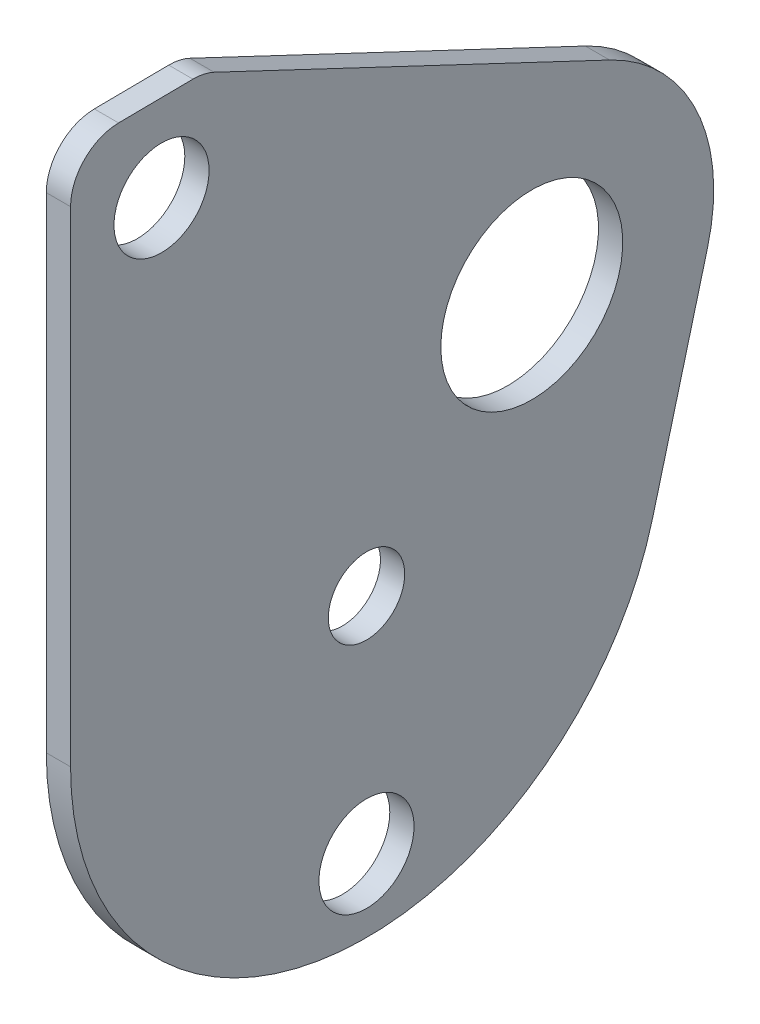
ISO-10303-21;
HEADER;
FILE_DESCRIPTION(('STEP AP214'),'2;1');
FILE_NAME('part.step','',(''),(''),'','','');
FILE_SCHEMA(('AUTOMOTIVE_DESIGN { 1 0 10303 214 1 1 1 1 }'));
ENDSEC;
DATA;
#1=APPLICATION_CONTEXT('core data for automotive mechanical design processes');
#2=APPLICATION_PROTOCOL_DEFINITION('international standard','automotive_design',2000,#1);
#3=PRODUCT_CONTEXT('',#1,'mechanical');
#4=PRODUCT('Part','Part','',(#3));
#5=PRODUCT_RELATED_PRODUCT_CATEGORY('part','',(#4));
#6=PRODUCT_DEFINITION_FORMATION('','',#4);
#7=PRODUCT_DEFINITION_CONTEXT('part definition',#1,'design');
#8=PRODUCT_DEFINITION('design','',#6,#7);
#9=PRODUCT_DEFINITION_SHAPE('','',#8);
#10=(LENGTH_UNIT() NAMED_UNIT(*) SI_UNIT(.MILLI.,.METRE.));
#11=(NAMED_UNIT(*) PLANE_ANGLE_UNIT() SI_UNIT($,.RADIAN.));
#12=(NAMED_UNIT(*) SI_UNIT($,.STERADIAN.) SOLID_ANGLE_UNIT());
#13=UNCERTAINTY_MEASURE_WITH_UNIT(LENGTH_MEASURE(1.E-05),#10,'distance_accuracy_value','');
#14=(GEOMETRIC_REPRESENTATION_CONTEXT(3) GLOBAL_UNCERTAINTY_ASSIGNED_CONTEXT((#13)) GLOBAL_UNIT_ASSIGNED_CONTEXT((#10,
#11,#12)) REPRESENTATION_CONTEXT('',''));
#15=CARTESIAN_POINT('',(0.,0.,0.));
#16=DIRECTION('',(0.,0.,1.));
#17=DIRECTION('',(1.,0.,0.));
#18=AXIS2_PLACEMENT_3D('',#15,#16,#17);
#19=CARTESIAN_POINT('',(18.2118,32.6740607769863,-155.239693244064));
#20=DIRECTION('',(0.,-0.999949674871077,-0.0100323339870091));
#21=DIRECTION('',(0.,0.0100323339870091,-0.999949674871077));
#22=AXIS2_PLACEMENT_3D('',#19,#20,#21);
#23=PLANE('',#22);
#24=DIRECTION('',(0.,-0.0100323339870091,0.999949674871077));
#25=VECTOR('',#24,1.);
#26=CARTESIAN_POINT('',(18.2118,32.6740607769863,-155.239693244064));
#27=LINE('',#26,#25);
#28=CARTESIAN_POINT('',(18.2118,32.7383484801759,-161.64742129478));
#29=VERTEX_POINT('',#28);
#30=CARTESIAN_POINT('',(18.2118,32.6992885296811,-157.754211115736));
#31=VERTEX_POINT('',#30);
#32=EDGE_CURVE('E168',#29,#31,#27,.T.);
#33=ORIENTED_EDGE('',*,*,#32,.T.);
#34=DIRECTION('',(-1.,0.,0.));
#35=VECTOR('',#34,1.);
#36=CARTESIAN_POINT('',(18.2118,32.6992885296811,-157.754211115736));
#37=LINE('',#36,#35);
#38=CARTESIAN_POINT('',(19.4818,32.6992885296811,-157.754211115736));
#39=VERTEX_POINT('',#38);
#40=EDGE_CURVE('E59',#31,#39,#37,.F.);
#41=ORIENTED_EDGE('',*,*,#40,.T.);
#42=DIRECTION('',(0.,-0.0100323339870091,0.999949674871077));
#43=VECTOR('',#42,1.);
#44=CARTESIAN_POINT('',(19.4818,32.6740607769863,-155.239693244064));
#45=LINE('',#44,#43);
#46=CARTESIAN_POINT('',(19.4818,32.7383484801759,-161.64742129478));
#47=VERTEX_POINT('',#46);
#48=EDGE_CURVE('E152',#47,#39,#45,.T.);
#49=ORIENTED_EDGE('',*,*,#48,.F.);
#50=DIRECTION('',(1.,0.,0.));
#51=VECTOR('',#50,1.);
#52=CARTESIAN_POINT('',(18.2118,32.7383484801759,-161.64742129478));
#53=LINE('',#52,#51);
#54=EDGE_CURVE('E145',#47,#29,#53,.F.);
#55=ORIENTED_EDGE('',*,*,#54,.T.);
#56=EDGE_LOOP('',(#33,#41,#49,#55));
#57=FACE_BOUND('',#56,.T.);
#58=ADVANCED_FACE('F37',(#57),#23,.F.);
#59=CARTESIAN_POINT('',(18.2118,4.7625,-170.733693244064));
#60=DIRECTION('',(-1.,0.,0.));
#61=DIRECTION('',(0.,0.,1.));
#62=AXIS2_PLACEMENT_3D('',#59,#60,#61);
#63=CYLINDRICAL_SURFACE('',#62,15.494);
#64=CARTESIAN_POINT('',(19.4818,4.7625,-170.733693244064));
#65=DIRECTION('',(1.,0.,0.));
#66=DIRECTION('',(0.,0.,-1.));
#67=AXIS2_PLACEMENT_3D('',#64,#65,#66);
#68=CIRCLE('',#67,15.494);
#69=CARTESIAN_POINT('',(19.4818,4.76249999999999,-155.239693244064));
#70=VERTEX_POINT('',#69);
#71=CARTESIAN_POINT('',(19.4818,0.784017616500314,-185.70819537015));
#72=VERTEX_POINT('',#71);
#73=EDGE_CURVE('E182',#70,#72,#68,.T.);
#74=ORIENTED_EDGE('',*,*,#73,.F.);
#75=DIRECTION('',(-1.,0.,0.));
#76=VECTOR('',#75,1.);
#77=CARTESIAN_POINT('',(22.9743,4.76249999999999,-155.239693244064));
#78=LINE('',#77,#76);
#79=CARTESIAN_POINT('',(18.2118,4.76249999999999,-155.239693244064));
#80=VERTEX_POINT('',#79);
#81=EDGE_CURVE('E160',#70,#80,#78,.T.);
#82=ORIENTED_EDGE('',*,*,#81,.T.);
#83=CARTESIAN_POINT('',(18.2118,4.7625,-170.733693244064));
#84=DIRECTION('',(1.,0.,0.));
#85=DIRECTION('',(0.,0.,-1.));
#86=AXIS2_PLACEMENT_3D('',#83,#84,#85);
#87=CIRCLE('',#86,15.494);
#88=CARTESIAN_POINT('',(18.2118,0.784017616500314,-185.70819537015));
#89=VERTEX_POINT('',#88);
#90=EDGE_CURVE('E137',#80,#89,#87,.T.);
#91=ORIENTED_EDGE('',*,*,#90,.T.);
#92=DIRECTION('',(1.,0.,0.));
#93=VECTOR('',#92,1.);
#94=CARTESIAN_POINT('',(-33.8582,0.784017616500314,-185.70819537015));
#95=LINE('',#94,#93);
#96=EDGE_CURVE('E135',#89,#72,#95,.T.);
#97=ORIENTED_EDGE('',*,*,#96,.T.);
#98=EDGE_LOOP('',(#74,#82,#91,#97));
#99=FACE_BOUND('',#98,.T.);
#100=ADVANCED_FACE('F204',(#99),#63,.T.);
#101=CARTESIAN_POINT('',(18.2118,23.6225731721549,-155.239693244064));
#102=DIRECTION('',(0.,0.,-1.));
#103=DIRECTION('',(-1.,0.,0.));
#104=AXIS2_PLACEMENT_3D('',#101,#102,#103);
#105=PLANE('',#104);
#106=DIRECTION('',(0.,-1.,0.));
#107=VECTOR('',#106,1.);
#108=CARTESIAN_POINT('',(19.4818,23.6225731721549,-155.239693244064));
#109=LINE('',#108,#107);
#110=CARTESIAN_POINT('',(19.4818,30.1594163555086,-155.239693244064));
#111=VERTEX_POINT('',#110);
#112=EDGE_CURVE('E150',#111,#70,#109,.T.);
#113=ORIENTED_EDGE('',*,*,#112,.F.);
#114=DIRECTION('',(-1.,0.,0.));
#115=VECTOR('',#114,1.);
#116=CARTESIAN_POINT('',(18.2118,30.1594163555086,-155.239693244064));
#117=LINE('',#116,#115);
#118=CARTESIAN_POINT('',(18.2118,30.1594163555086,-155.239693244064));
#119=VERTEX_POINT('',#118);
#120=EDGE_CURVE('E115',#111,#119,#117,.T.);
#121=ORIENTED_EDGE('',*,*,#120,.T.);
#122=DIRECTION('',(0.,-1.,0.));
#123=VECTOR('',#122,1.);
#124=CARTESIAN_POINT('',(18.2118,32.6740607769863,-155.239693244064));
#125=LINE('',#124,#123);
#126=EDGE_CURVE('E171',#119,#80,#125,.T.);
#127=ORIENTED_EDGE('',*,*,#126,.T.);
#128=ORIENTED_EDGE('',*,*,#81,.F.);
#129=EDGE_LOOP('',(#113,#121,#127,#128));
#130=FACE_BOUND('',#129,.T.);
#131=ADVANCED_FACE('F157',(#130),#105,.F.);
#132=CARTESIAN_POINT('',(22.9743,4.7625,-170.733693244064));
#133=DIRECTION('',(-1.,0.,0.));
#134=DIRECTION('',(0.,0.,1.));
#135=AXIS2_PLACEMENT_3D('',#132,#133,#134);
#136=CYLINDRICAL_SURFACE('',#135,2.);
#137=CARTESIAN_POINT('',(18.2118,4.7625,-170.733693244064));
#138=DIRECTION('',(1.,0.,0.));
#139=DIRECTION('',(0.,0.,-1.));
#140=AXIS2_PLACEMENT_3D('',#137,#138,#139);
#141=CIRCLE('',#140,2.);
#142=CARTESIAN_POINT('',(18.2118,4.7625,-168.733693244064));
#143=VERTEX_POINT('',#142);
#144=EDGE_CURVE('E172',#143,#143,#141,.T.);
#145=CARTESIAN_POINT('',(19.4818,4.7625,-170.733693244064));
#146=DIRECTION('',(1.,0.,0.));
#147=DIRECTION('',(0.,0.,-1.));
#148=AXIS2_PLACEMENT_3D('',#145,#146,#147);
#149=CIRCLE('',#148,2.);
#150=CARTESIAN_POINT('',(19.4818,4.7625,-168.733693244064));
#151=VERTEX_POINT('',#150);
#152=EDGE_CURVE('E173',#151,#151,#149,.T.);
#153=CARTESIAN_POINT('',(18.2118,4.7625,-168.733693244064));
#154=CARTESIAN_POINT('',(18.2250291666667,4.7625,-168.733693244064));
#155=CARTESIAN_POINT('',(18.2382583333334,4.7625,-168.733693244064));
#156=CARTESIAN_POINT('',(18.2647166666667,4.7625,-168.733693244064));
#157=CARTESIAN_POINT('',(18.2779458333334,4.7625,-168.733693244064));
#158=CARTESIAN_POINT('',(18.3044041666667,4.7625,-168.733693244064));
#159=CARTESIAN_POINT('',(18.3176333333334,4.7625,-168.733693244064));
#160=CARTESIAN_POINT('',(18.3440916666667,4.7625,-168.733693244064));
#161=CARTESIAN_POINT('',(18.3573208333334,4.7625,-168.733693244064));
#162=CARTESIAN_POINT('',(18.3837791666667,4.7625,-168.733693244064));
#163=CARTESIAN_POINT('',(18.3970083333333,4.7625,-168.733693244064));
#164=CARTESIAN_POINT('',(18.4234666666667,4.7625,-168.733693244064));
#165=CARTESIAN_POINT('',(18.4366958333333,4.7625,-168.733693244064));
#166=CARTESIAN_POINT('',(18.4631541666667,4.7625,-168.733693244064));
#167=CARTESIAN_POINT('',(18.4763833333333,4.7625,-168.733693244064));
#168=CARTESIAN_POINT('',(18.5028416666667,4.7625,-168.733693244064));
#169=CARTESIAN_POINT('',(18.5160708333333,4.7625,-168.733693244064));
#170=CARTESIAN_POINT('',(18.5425291666667,4.7625,-168.733693244064));
#171=CARTESIAN_POINT('',(18.5557583333333,4.7625,-168.733693244064));
#172=CARTESIAN_POINT('',(18.5822166666667,4.7625,-168.733693244064));
#173=CARTESIAN_POINT('',(18.5954458333334,4.7625,-168.733693244064));
#174=CARTESIAN_POINT('',(18.6219041666667,4.7625,-168.733693244064));
#175=CARTESIAN_POINT('',(18.6351333333333,4.7625,-168.733693244064));
#176=CARTESIAN_POINT('',(18.6615916666667,4.7625,-168.733693244064));
#177=CARTESIAN_POINT('',(18.6748208333334,4.7625,-168.733693244064));
#178=CARTESIAN_POINT('',(18.7012791666667,4.7625,-168.733693244064));
#179=CARTESIAN_POINT('',(18.7145083333333,4.7625,-168.733693244064));
#180=CARTESIAN_POINT('',(18.7409666666667,4.7625,-168.733693244064));
#181=CARTESIAN_POINT('',(18.7541958333334,4.7625,-168.733693244064));
#182=CARTESIAN_POINT('',(18.7806541666667,4.7625,-168.733693244064));
#183=CARTESIAN_POINT('',(18.7938833333334,4.7625,-168.733693244064));
#184=CARTESIAN_POINT('',(18.8203416666667,4.7625,-168.733693244064));
#185=CARTESIAN_POINT('',(18.8335708333334,4.7625,-168.733693244064));
#186=CARTESIAN_POINT('',(18.8600291666667,4.7625,-168.733693244064));
#187=CARTESIAN_POINT('',(18.8732583333334,4.7625,-168.733693244064));
#188=CARTESIAN_POINT('',(18.8997166666667,4.7625,-168.733693244064));
#189=CARTESIAN_POINT('',(18.9129458333333,4.7625,-168.733693244064));
#190=CARTESIAN_POINT('',(18.9394041666667,4.7625,-168.733693244064));
#191=CARTESIAN_POINT('',(18.9526333333333,4.7625,-168.733693244064));
#192=CARTESIAN_POINT('',(18.9790916666667,4.7625,-168.733693244064));
#193=CARTESIAN_POINT('',(18.9923208333334,4.7625,-168.733693244064));
#194=CARTESIAN_POINT('',(19.0187791666667,4.7625,-168.733693244064));
#195=CARTESIAN_POINT('',(19.0320083333334,4.7625,-168.733693244064));
#196=CARTESIAN_POINT('',(19.0584666666667,4.7625,-168.733693244064));
#197=CARTESIAN_POINT('',(19.0716958333334,4.7625,-168.733693244064));
#198=CARTESIAN_POINT('',(19.0981541666667,4.7625,-168.733693244064));
#199=CARTESIAN_POINT('',(19.1113833333334,4.7625,-168.733693244064));
#200=CARTESIAN_POINT('',(19.1378416666667,4.7625,-168.733693244064));
#201=CARTESIAN_POINT('',(19.1510708333333,4.7625,-168.733693244064));
#202=CARTESIAN_POINT('',(19.1775291666667,4.7625,-168.733693244064));
#203=CARTESIAN_POINT('',(19.1907583333333,4.7625,-168.733693244064));
#204=CARTESIAN_POINT('',(19.2172166666667,4.7625,-168.733693244064));
#205=CARTESIAN_POINT('',(19.2304458333333,4.7625,-168.733693244064));
#206=CARTESIAN_POINT('',(19.2569041666667,4.7625,-168.733693244064));
#207=CARTESIAN_POINT('',(19.2701333333333,4.7625,-168.733693244064));
#208=CARTESIAN_POINT('',(19.2965916666667,4.7625,-168.733693244064));
#209=CARTESIAN_POINT('',(19.3098208333333,4.7625,-168.733693244064));
#210=CARTESIAN_POINT('',(19.3362791666667,4.7625,-168.733693244064));
#211=CARTESIAN_POINT('',(19.3495083333333,4.7625,-168.733693244064));
#212=CARTESIAN_POINT('',(19.3759666666667,4.7625,-168.733693244064));
#213=CARTESIAN_POINT('',(19.3891958333333,4.7625,-168.733693244064));
#214=CARTESIAN_POINT('',(19.4156541666667,4.7625,-168.733693244064));
#215=CARTESIAN_POINT('',(19.4288833333334,4.7625,-168.733693244064));
#216=CARTESIAN_POINT('',(19.4553416666667,4.7625,-168.733693244064));
#217=CARTESIAN_POINT('',(19.4685708333334,4.7625,-168.733693244064));
#218=CARTESIAN_POINT('',(19.4818,4.7625,-168.733693244064));
#219=B_SPLINE_CURVE_WITH_KNOTS('',3,(#153,#154,#155,#156,#157,#158,#159,#160,#161,#162,#163,
#164,#165,#166,#167,#168,#169,#170,#171,#172,#173,#174,#175,#176,#177,#178,#179,#180,#181,#182,
#183,#184,#185,#186,#187,#188,#189,#190,#191,#192,#193,#194,#195,#196,#197,#198,#199,#200,#201,
#202,#203,#204,#205,#206,#207,#208,#209,#210,#211,#212,#213,#214,#215,#216,#217,#218),
.UNSPECIFIED.,.F.,.F.,(4,2,2,2,2,2,2,2,2,2,2,2,2,2,2,2,2,2,2,2,2,2,2,2,2,2,2,2,2,2,2,2,4),(0.,
0.0396874999999998,0.0793749999999996,0.119062499999999,0.158749999999999,0.198437499999999,
0.238124999999999,0.277812499999999,0.317499999999998,0.357187499999998,0.396874999999998,
0.436562499999998,0.476250000000001,0.515937499999997,0.555625000000001,0.5953125,0.635,
0.6746875,0.714375,0.7540625,0.793749999999999,0.833437499999999,0.873124999999999,
0.912812499999999,0.952499999999998,0.992187499999998,1.031875,1.0715625,1.11125,1.1509375,
1.190625,1.2303125,1.27),.UNSPECIFIED.);
#220=EDGE_CURVE('BSEAM224',#143,#151,#219,.T.);
#221=ORIENTED_EDGE('',*,*,#144,.F.);
#222=ORIENTED_EDGE('',*,*,#152,.T.);
#223=ORIENTED_EDGE('',*,*,#220,.T.);
#224=ORIENTED_EDGE('',*,*,#220,.F.);
#225=EDGE_LOOP('',(#221,#223,#222,#224));
#226=FACE_BOUND('',#225,.T.);
#227=ADVANCED_FACE('F224',(#226),#136,.F.);
#228=CARTESIAN_POINT('',(40.0253837676858,14.088357975241,-179.3875));
#229=DIRECTION('',(-1.,0.,0.));
#230=DIRECTION('',(0.,0.,1.));
#231=AXIS2_PLACEMENT_3D('',#228,#229,#230);
#232=CYLINDRICAL_SURFACE('',#231,4.76250000000001);
#233=CARTESIAN_POINT('',(18.2118,14.088357975241,-179.3875));
#234=DIRECTION('',(-1.,0.,0.));
#235=DIRECTION('',(0.,0.,1.));
#236=AXIS2_PLACEMENT_3D('',#233,#234,#235);
#237=CIRCLE('',#236,4.76250000000001);
#238=CARTESIAN_POINT('',(18.2118,14.088357975241,-174.625));
#239=VERTEX_POINT('',#238);
#240=EDGE_CURVE('E161',#239,#239,#237,.T.);
#241=CARTESIAN_POINT('',(19.4818,14.088357975241,-179.3875));
#242=DIRECTION('',(1.,0.,0.));
#243=DIRECTION('',(0.,0.,-1.));
#244=AXIS2_PLACEMENT_3D('',#241,#242,#243);
#245=CIRCLE('',#244,4.76250000000001);
#246=CARTESIAN_POINT('',(19.4818,14.088357975241,-174.625));
#247=VERTEX_POINT('',#246);
#248=EDGE_CURVE('E122',#247,#247,#245,.F.);
#249=CARTESIAN_POINT('',(18.2118,14.088357975241,-174.625));
#250=CARTESIAN_POINT('',(18.2250291666667,14.088357975241,-174.625));
#251=CARTESIAN_POINT('',(18.2382583333334,14.088357975241,-174.625));
#252=CARTESIAN_POINT('',(18.2647166666667,14.088357975241,-174.625));
#253=CARTESIAN_POINT('',(18.2779458333334,14.088357975241,-174.625));
#254=CARTESIAN_POINT('',(18.3044041666667,14.088357975241,-174.625));
#255=CARTESIAN_POINT('',(18.3176333333334,14.088357975241,-174.625));
#256=CARTESIAN_POINT('',(18.3440916666667,14.088357975241,-174.625));
#257=CARTESIAN_POINT('',(18.3573208333334,14.088357975241,-174.625));
#258=CARTESIAN_POINT('',(18.3837791666667,14.088357975241,-174.625));
#259=CARTESIAN_POINT('',(18.3970083333333,14.088357975241,-174.625));
#260=CARTESIAN_POINT('',(18.4234666666667,14.088357975241,-174.625));
#261=CARTESIAN_POINT('',(18.4366958333333,14.088357975241,-174.625));
#262=CARTESIAN_POINT('',(18.4631541666667,14.088357975241,-174.625));
#263=CARTESIAN_POINT('',(18.4763833333333,14.088357975241,-174.625));
#264=CARTESIAN_POINT('',(18.5028416666667,14.088357975241,-174.625));
#265=CARTESIAN_POINT('',(18.5160708333333,14.088357975241,-174.625));
#266=CARTESIAN_POINT('',(18.5425291666667,14.088357975241,-174.625));
#267=CARTESIAN_POINT('',(18.5557583333334,14.088357975241,-174.625));
#268=CARTESIAN_POINT('',(18.5822166666667,14.088357975241,-174.625));
#269=CARTESIAN_POINT('',(18.5954458333334,14.088357975241,-174.625));
#270=CARTESIAN_POINT('',(18.6219041666667,14.088357975241,-174.625));
#271=CARTESIAN_POINT('',(18.6351333333334,14.088357975241,-174.625));
#272=CARTESIAN_POINT('',(18.6615916666667,14.088357975241,-174.625));
#273=CARTESIAN_POINT('',(18.6748208333334,14.088357975241,-174.625));
#274=CARTESIAN_POINT('',(18.7012791666667,14.088357975241,-174.625));
#275=CARTESIAN_POINT('',(18.7145083333334,14.088357975241,-174.625));
#276=CARTESIAN_POINT('',(18.7409666666667,14.088357975241,-174.625));
#277=CARTESIAN_POINT('',(18.7541958333334,14.088357975241,-174.625));
#278=CARTESIAN_POINT('',(18.7806541666667,14.088357975241,-174.625));
#279=CARTESIAN_POINT('',(18.7938833333334,14.088357975241,-174.625));
#280=CARTESIAN_POINT('',(18.8203416666667,14.088357975241,-174.625));
#281=CARTESIAN_POINT('',(18.8335708333334,14.088357975241,-174.625));
#282=CARTESIAN_POINT('',(18.8600291666667,14.088357975241,-174.625));
#283=CARTESIAN_POINT('',(18.8732583333334,14.088357975241,-174.625));
#284=CARTESIAN_POINT('',(18.8997166666667,14.088357975241,-174.625));
#285=CARTESIAN_POINT('',(18.9129458333333,14.088357975241,-174.625));
#286=CARTESIAN_POINT('',(18.9394041666667,14.088357975241,-174.625));
#287=CARTESIAN_POINT('',(18.9526333333333,14.088357975241,-174.625));
#288=CARTESIAN_POINT('',(18.9790916666667,14.088357975241,-174.625));
#289=CARTESIAN_POINT('',(18.9923208333334,14.088357975241,-174.625));
#290=CARTESIAN_POINT('',(19.0187791666667,14.088357975241,-174.625));
#291=CARTESIAN_POINT('',(19.0320083333334,14.088357975241,-174.625));
#292=CARTESIAN_POINT('',(19.0584666666667,14.088357975241,-174.625));
#293=CARTESIAN_POINT('',(19.0716958333334,14.088357975241,-174.625));
#294=CARTESIAN_POINT('',(19.0981541666667,14.088357975241,-174.625));
#295=CARTESIAN_POINT('',(19.1113833333334,14.088357975241,-174.625));
#296=CARTESIAN_POINT('',(19.1378416666667,14.088357975241,-174.625));
#297=CARTESIAN_POINT('',(19.1510708333334,14.088357975241,-174.625));
#298=CARTESIAN_POINT('',(19.1775291666667,14.088357975241,-174.625));
#299=CARTESIAN_POINT('',(19.1907583333334,14.088357975241,-174.625));
#300=CARTESIAN_POINT('',(19.2172166666667,14.088357975241,-174.625));
#301=CARTESIAN_POINT('',(19.2304458333334,14.088357975241,-174.625));
#302=CARTESIAN_POINT('',(19.2569041666667,14.088357975241,-174.625));
#303=CARTESIAN_POINT('',(19.2701333333334,14.088357975241,-174.625));
#304=CARTESIAN_POINT('',(19.2965916666667,14.088357975241,-174.625));
#305=CARTESIAN_POINT('',(19.3098208333334,14.088357975241,-174.625));
#306=CARTESIAN_POINT('',(19.3362791666667,14.088357975241,-174.625));
#307=CARTESIAN_POINT('',(19.3495083333334,14.088357975241,-174.625));
#308=CARTESIAN_POINT('',(19.3759666666667,14.088357975241,-174.625));
#309=CARTESIAN_POINT('',(19.3891958333334,14.088357975241,-174.625));
#310=CARTESIAN_POINT('',(19.4156541666667,14.088357975241,-174.625));
#311=CARTESIAN_POINT('',(19.4288833333334,14.088357975241,-174.625));
#312=CARTESIAN_POINT('',(19.4553416666667,14.088357975241,-174.625));
#313=CARTESIAN_POINT('',(19.4685708333334,14.088357975241,-174.625));
#314=CARTESIAN_POINT('',(19.4818,14.088357975241,-174.625));
#315=B_SPLINE_CURVE_WITH_KNOTS('',3,(#249,#250,#251,#252,#253,#254,#255,#256,#257,#258,#259,
#260,#261,#262,#263,#264,#265,#266,#267,#268,#269,#270,#271,#272,#273,#274,#275,#276,#277,#278,
#279,#280,#281,#282,#283,#284,#285,#286,#287,#288,#289,#290,#291,#292,#293,#294,#295,#296,#297,
#298,#299,#300,#301,#302,#303,#304,#305,#306,#307,#308,#309,#310,#311,#312,#313,#314),
.UNSPECIFIED.,.F.,.F.,(4,2,2,2,2,2,2,2,2,2,2,2,2,2,2,2,2,2,2,2,2,2,2,2,2,2,2,2,2,2,2,2,4),(0.,
0.0396874999999998,0.0793749999999996,0.119062499999999,0.158749999999999,0.198437499999999,
0.238124999999999,0.277812499999999,0.317499999999998,0.357187500000002,0.396875000000001,
0.436562500000001,0.476250000000001,0.515937500000001,0.555625000000001,0.5953125,0.635,
0.6746875,0.714375,0.7540625,0.793749999999999,0.833437499999999,0.873124999999999,
0.912812499999999,0.952500000000002,0.992187500000002,1.031875,1.0715625,1.11125,1.1509375,
1.190625,1.2303125,1.27),.UNSPECIFIED.);
#316=EDGE_CURVE('BSEAM221',#239,#247,#315,.T.);
#317=ORIENTED_EDGE('',*,*,#240,.T.);
#318=ORIENTED_EDGE('',*,*,#248,.F.);
#319=ORIENTED_EDGE('',*,*,#316,.T.);
#320=ORIENTED_EDGE('',*,*,#316,.F.);
#321=EDGE_LOOP('',(#317,#319,#318,#320));
#322=FACE_BOUND('',#321,.T.);
#323=ADVANCED_FACE('F221',(#322),#232,.F.);
#324=CARTESIAN_POINT('',(-33.8582,89.4766831336706,-42.3403974478338));
#325=DIRECTION('',(0.,-0.903906976361632,0.427729094269693));
#326=DIRECTION('',(0.,-0.427729094269693,-0.903906976361632));
#327=AXIS2_PLACEMENT_3D('',#324,#325,#326);
#328=PLANE('',#327);
#329=DIRECTION('',(0.,-0.427729094269693,-0.903906976361632));
#330=VECTOR('',#329,1.);
#331=CARTESIAN_POINT('',(18.2118,3.82570673011289,-223.344018993732));
#332=LINE('',#331,#330);
#333=CARTESIAN_POINT('',(18.2118,32.4944000259619,-162.759335322552));
#334=VERTEX_POINT('',#333);
#335=CARTESIAN_POINT('',(18.2118,22.6980719250855,-183.461619622919));
#336=VERTEX_POINT('',#335);
#337=EDGE_CURVE('E176',#334,#336,#332,.T.);
#338=ORIENTED_EDGE('',*,*,#337,.F.);
#339=DIRECTION('',(1.,0.,0.));
#340=VECTOR('',#339,1.);
#341=CARTESIAN_POINT('',(-33.8582,32.4944000259619,-162.759335322552));
#342=LINE('',#341,#340);
#343=CARTESIAN_POINT('',(19.4818,32.4944000259619,-162.759335322552));
#344=VERTEX_POINT('',#343);
#345=EDGE_CURVE('E11',#334,#344,#342,.T.);
#346=ORIENTED_EDGE('',*,*,#345,.T.);
#347=DIRECTION('',(0.,0.427729094269693,0.903906976361632));
#348=VECTOR('',#347,1.);
#349=CARTESIAN_POINT('',(19.4818,89.4766831336706,-42.3403974478338));
#350=LINE('',#349,#348);
#351=CARTESIAN_POINT('',(19.4818,22.6980719250855,-183.461619622919));
#352=VERTEX_POINT('',#351);
#353=EDGE_CURVE('E108',#352,#344,#350,.T.);
#354=ORIENTED_EDGE('',*,*,#353,.F.);
#355=DIRECTION('',(1.,0.,0.));
#356=VECTOR('',#355,1.);
#357=CARTESIAN_POINT('',(-33.8582,22.6980719250855,-183.461619622919));
#358=LINE('',#357,#356);
#359=EDGE_CURVE('E116',#336,#352,#358,.T.);
#360=ORIENTED_EDGE('',*,*,#359,.F.);
#361=EDGE_LOOP('',(#338,#346,#354,#360));
#362=FACE_BOUND('',#361,.T.);
#363=ADVANCED_FACE('F121',(#362),#328,.F.);
#364=CARTESIAN_POINT('',(-33.8582,-46.0348142516997,-173.26919097219));
#365=DIRECTION('',(0.,-0.256775679843789,-0.966471029178195));
#366=DIRECTION('',(0.,0.966471029178195,-0.256775679843789));
#367=AXIS2_PLACEMENT_3D('',#364,#365,#366);
#368=PLANE('',#367);
#369=DIRECTION('',(1.,0.,0.));
#370=VECTOR('',#369,1.);
#371=CARTESIAN_POINT('',(-33.8582,11.6425696247289,-188.593136552922));
#372=LINE('',#371,#370);
#373=CARTESIAN_POINT('',(18.2118,11.6425696247289,-188.593136552922));
#374=VERTEX_POINT('',#373);
#375=CARTESIAN_POINT('',(19.4818,11.6425696247289,-188.593136552922));
#376=VERTEX_POINT('',#375);
#377=EDGE_CURVE('E128',#374,#376,#372,.T.);
#378=ORIENTED_EDGE('',*,*,#377,.T.);
#379=DIRECTION('',(0.,-0.966471029178195,0.256775679843789));
#380=VECTOR('',#379,1.);
#381=CARTESIAN_POINT('',(19.4818,-46.0348142516997,-173.26919097219));
#382=LINE('',#381,#380);
#383=EDGE_CURVE('E110',#376,#72,#382,.T.);
#384=ORIENTED_EDGE('',*,*,#383,.T.);
#385=ORIENTED_EDGE('',*,*,#96,.F.);
#386=DIRECTION('',(0.,0.966471029178195,-0.256775679843789));
#387=VECTOR('',#386,1.);
#388=CARTESIAN_POINT('',(18.2118,8.94237288250982,-187.875738065784));
#389=LINE('',#388,#387);
#390=EDGE_CURVE('E130',#89,#374,#389,.T.);
#391=ORIENTED_EDGE('',*,*,#390,.T.);
#392=EDGE_LOOP('',(#378,#384,#385,#391));
#393=FACE_BOUND('',#392,.T.);
#394=ADVANCED_FACE('F193',(#393),#368,.T.);
#395=CARTESIAN_POINT('',(-33.8582,14.088357975241,-179.3875));
#396=DIRECTION('',(1.,0.,0.));
#397=DIRECTION('',(0.,0.,-1.));
#398=AXIS2_PLACEMENT_3D('',#395,#396,#397);
#399=CYLINDRICAL_SURFACE('',#398,9.52499999999998);
#400=CARTESIAN_POINT('',(19.4818,14.088357975241,-179.3875));
#401=DIRECTION('',(1.,0.,0.));
#402=DIRECTION('',(0.,0.,-1.));
#403=AXIS2_PLACEMENT_3D('',#400,#401,#402);
#404=CIRCLE('',#403,9.52499999999998);
#405=EDGE_CURVE('E104',#376,#352,#404,.T.);
#406=ORIENTED_EDGE('',*,*,#405,.F.);
#407=ORIENTED_EDGE('',*,*,#377,.F.);
#408=CARTESIAN_POINT('',(18.2118,14.088357975241,-179.3875));
#409=DIRECTION('',(1.,0.,0.));
#410=DIRECTION('',(0.,0.,-1.));
#411=AXIS2_PLACEMENT_3D('',#408,#409,#410);
#412=CIRCLE('',#411,9.52499999999998);
#413=EDGE_CURVE('E127',#336,#374,#412,.F.);
#414=ORIENTED_EDGE('',*,*,#413,.F.);
#415=ORIENTED_EDGE('',*,*,#359,.T.);
#416=EDGE_LOOP('',(#406,#407,#414,#415));
#417=FACE_BOUND('',#416,.T.);
#418=ADVANCED_FACE('F125',(#417),#399,.T.);
#419=CARTESIAN_POINT('',(18.2118,0.,-221.533693244064));
#420=DIRECTION('',(1.,0.,0.));
#421=DIRECTION('',(0.,0.,-1.));
#422=AXIS2_PLACEMENT_3D('',#419,#420,#421);
#423=PLANE('',#422);
#424=CARTESIAN_POINT('',(18.2118,28.1790332703073,-160.002193244064));
#425=DIRECTION('',(1.,0.,0.));
#426=DIRECTION('',(0.,0.,-1.));
#427=AXIS2_PLACEMENT_3D('',#424,#425,#426);
#428=CIRCLE('',#427,2.4892);
#429=CARTESIAN_POINT('',(18.2118,28.1790332703073,-162.491393244064));
#430=VERTEX_POINT('',#429);
#431=EDGE_CURVE('E241',#430,#430,#428,.T.);
#432=ORIENTED_EDGE('',*,*,#431,.T.);
#433=EDGE_LOOP('',(#432));
#434=FACE_BOUND('',#433,.T.);
#435=CARTESIAN_POINT('',(18.2118,-6.9215,-170.733693244064));
#436=DIRECTION('',(1.,0.,0.));
#437=DIRECTION('',(0.,0.,-1.));
#438=AXIS2_PLACEMENT_3D('',#435,#436,#437);
#439=CIRCLE('',#438,2.4892);
#440=CARTESIAN_POINT('',(18.2118,-6.9215,-173.222893244063));
#441=VERTEX_POINT('',#440);
#442=EDGE_CURVE('E249',#441,#441,#439,.T.);
#443=ORIENTED_EDGE('',*,*,#442,.T.);
#444=EDGE_LOOP('',(#443));
#445=FACE_BOUND('',#444,.T.);
#446=ORIENTED_EDGE('',*,*,#126,.F.);
#447=CARTESIAN_POINT('',(18.2118,30.1594163555086,-157.779693244063));
#448=DIRECTION('',(1.,0.,0.));
#449=DIRECTION('',(0.,0.,-1.));
#450=AXIS2_PLACEMENT_3D('',#447,#448,#449);
#451=CIRCLE('',#450,2.54);
#452=EDGE_CURVE('E143',#119,#31,#451,.F.);
#453=ORIENTED_EDGE('',*,*,#452,.T.);
#454=ORIENTED_EDGE('',*,*,#32,.F.);
#455=CARTESIAN_POINT('',(18.2118,30.1984763060034,-161.672903423107));
#456=DIRECTION('',(1.,0.,0.));
#457=DIRECTION('',(0.,0.,-1.));
#458=AXIS2_PLACEMENT_3D('',#455,#456,#457);
#459=CIRCLE('',#458,2.54);
#460=EDGE_CURVE('E141',#29,#334,#459,.F.);
#461=ORIENTED_EDGE('',*,*,#460,.T.);
#462=ORIENTED_EDGE('',*,*,#337,.T.);
#463=ORIENTED_EDGE('',*,*,#413,.T.);
#464=ORIENTED_EDGE('',*,*,#390,.F.);
#465=ORIENTED_EDGE('',*,*,#90,.F.);
#466=EDGE_LOOP('',(#446,#453,#454,#461,#462,#463,#464,#465));
#467=FACE_BOUND('',#466,.T.);
#468=ORIENTED_EDGE('',*,*,#240,.F.);
#469=EDGE_LOOP('',(#468));
#470=FACE_BOUND('',#469,.T.);
#471=ORIENTED_EDGE('',*,*,#144,.T.);
#472=EDGE_LOOP('',(#471));
#473=FACE_BOUND('',#472,.T.);
#474=ADVANCED_FACE('F166',(#434,#445,#467,#470,#473),#423,.F.);
#475=CARTESIAN_POINT('',(19.4818,-6.9215,-170.733693244064));
#476=DIRECTION('',(1.,0.,0.));
#477=DIRECTION('',(0.,0.,-1.));
#478=AXIS2_PLACEMENT_3D('',#475,#476,#477);
#479=PLANE('',#478);
#480=CARTESIAN_POINT('',(19.4818,28.1790332703073,-160.002193244064));
#481=DIRECTION('',(1.,0.,0.));
#482=DIRECTION('',(0.,0.,-1.));
#483=AXIS2_PLACEMENT_3D('',#480,#481,#482);
#484=CIRCLE('',#483,2.4892);
#485=CARTESIAN_POINT('',(19.4818,28.1790332703073,-162.491393244064));
#486=VERTEX_POINT('',#485);
#487=EDGE_CURVE('E244',#486,#486,#484,.T.);
#488=ORIENTED_EDGE('',*,*,#487,.F.);
#489=EDGE_LOOP('',(#488));
#490=FACE_BOUND('',#489,.T.);
#491=CARTESIAN_POINT('',(19.4818,-6.9215,-170.733693244064));
#492=DIRECTION('',(1.,0.,0.));
#493=DIRECTION('',(0.,0.,-1.));
#494=AXIS2_PLACEMENT_3D('',#491,#492,#493);
#495=CIRCLE('',#494,2.4892);
#496=CARTESIAN_POINT('',(19.4818,-6.9215,-173.222893244063));
#497=VERTEX_POINT('',#496);
#498=EDGE_CURVE('E245',#497,#497,#495,.T.);
#499=ORIENTED_EDGE('',*,*,#498,.F.);
#500=EDGE_LOOP('',(#499));
#501=FACE_BOUND('',#500,.T.);
#502=ORIENTED_EDGE('',*,*,#48,.T.);
#503=CARTESIAN_POINT('',(19.4818,30.1594163555086,-157.779693244063));
#504=DIRECTION('',(1.,0.,0.));
#505=DIRECTION('',(0.,0.,-1.));
#506=AXIS2_PLACEMENT_3D('',#503,#504,#505);
#507=CIRCLE('',#506,2.54);
#508=EDGE_CURVE('E45',#39,#111,#507,.T.);
#509=ORIENTED_EDGE('',*,*,#508,.T.);
#510=ORIENTED_EDGE('',*,*,#112,.T.);
#511=ORIENTED_EDGE('',*,*,#73,.T.);
#512=ORIENTED_EDGE('',*,*,#383,.F.);
#513=ORIENTED_EDGE('',*,*,#405,.T.);
#514=ORIENTED_EDGE('',*,*,#353,.T.);
#515=CARTESIAN_POINT('',(19.4818,30.1984763060034,-161.672903423107));
#516=DIRECTION('',(1.,0.,0.));
#517=DIRECTION('',(0.,0.,-1.));
#518=AXIS2_PLACEMENT_3D('',#515,#516,#517);
#519=CIRCLE('',#518,2.54);
#520=EDGE_CURVE('E52',#344,#47,#519,.T.);
#521=ORIENTED_EDGE('',*,*,#520,.T.);
#522=EDGE_LOOP('',(#502,#509,#510,#511,#512,#513,#514,#521));
#523=FACE_BOUND('',#522,.T.);
#524=ORIENTED_EDGE('',*,*,#152,.F.);
#525=EDGE_LOOP('',(#524));
#526=FACE_BOUND('',#525,.T.);
#527=ORIENTED_EDGE('',*,*,#248,.T.);
#528=EDGE_LOOP('',(#527));
#529=FACE_BOUND('',#528,.T.);
#530=ADVANCED_FACE('F106',(#490,#501,#523,#526,#529),#479,.T.);
#531=CARTESIAN_POINT('',(18.2118,30.1594163555086,-157.779693244063));
#532=DIRECTION('',(-1.,0.,0.));
#533=DIRECTION('',(0.,0.,1.));
#534=AXIS2_PLACEMENT_3D('',#531,#532,#533);
#535=CYLINDRICAL_SURFACE('',#534,2.54);
#536=ORIENTED_EDGE('',*,*,#508,.F.);
#537=ORIENTED_EDGE('',*,*,#40,.F.);
#538=ORIENTED_EDGE('',*,*,#452,.F.);
#539=ORIENTED_EDGE('',*,*,#120,.F.);
#540=EDGE_LOOP('',(#536,#537,#538,#539));
#541=FACE_BOUND('',#540,.T.);
#542=ADVANCED_FACE('F163',(#541),#535,.T.);
#543=CARTESIAN_POINT('',(-33.8582,30.1984763060034,-161.672903423107));
#544=DIRECTION('',(1.,0.,0.));
#545=DIRECTION('',(0.,0.,-1.));
#546=AXIS2_PLACEMENT_3D('',#543,#544,#545);
#547=CYLINDRICAL_SURFACE('',#546,2.54);
#548=ORIENTED_EDGE('',*,*,#460,.F.);
#549=ORIENTED_EDGE('',*,*,#54,.F.);
#550=ORIENTED_EDGE('',*,*,#520,.F.);
#551=ORIENTED_EDGE('',*,*,#345,.F.);
#552=EDGE_LOOP('',(#548,#549,#550,#551));
#553=FACE_BOUND('',#552,.T.);
#554=ADVANCED_FACE('F39',(#553),#547,.T.);
#555=CARTESIAN_POINT('',(18.2118,-6.9215,-170.733693244064));
#556=DIRECTION('',(1.,0.,0.));
#557=DIRECTION('',(0.,0.,-1.));
#558=AXIS2_PLACEMENT_3D('',#555,#556,#557);
#559=CYLINDRICAL_SURFACE('',#558,2.4892);
#560=ORIENTED_EDGE('',*,*,#442,.F.);
#561=EDGE_LOOP('',(#560));
#562=FACE_BOUND('',#561,.T.);
#563=ORIENTED_EDGE('',*,*,#498,.T.);
#564=EDGE_LOOP('',(#563));
#565=FACE_BOUND('',#564,.T.);
#566=ADVANCED_FACE('F195',(#562,#565),#559,.F.);
#567=CARTESIAN_POINT('',(18.2118,28.1790332703073,-160.002193244064));
#568=DIRECTION('',(1.,0.,0.));
#569=DIRECTION('',(0.,0.,-1.));
#570=AXIS2_PLACEMENT_3D('',#567,#568,#569);
#571=CYLINDRICAL_SURFACE('',#570,2.4892);
#572=ORIENTED_EDGE('',*,*,#431,.F.);
#573=EDGE_LOOP('',(#572));
#574=FACE_BOUND('',#573,.T.);
#575=ORIENTED_EDGE('',*,*,#487,.T.);
#576=EDGE_LOOP('',(#575));
#577=FACE_BOUND('',#576,.T.);
#578=ADVANCED_FACE('F200',(#574,#577),#571,.F.);
#579=CLOSED_SHELL('',(#58,#100,#131,#227,#323,#363,#394,#418,#474,#530,#542,#554,#566,#578));
#580=MANIFOLD_SOLID_BREP('B2',#579);
#581=ADVANCED_BREP_SHAPE_REPRESENTATION('',(#18,#580),#14);
#582=SHAPE_DEFINITION_REPRESENTATION(#9,#581);
ENDSEC;
END-ISO-10303-21;
